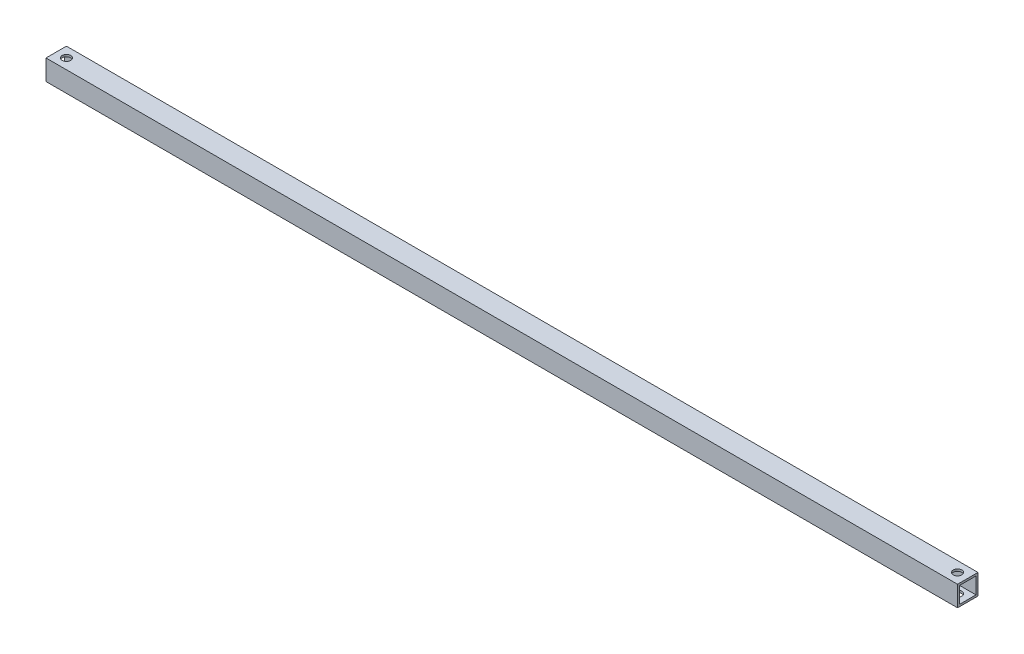
ISO-10303-21;
HEADER;
FILE_DESCRIPTION(('STEP AP214'),'2;1');
FILE_NAME('part.step','',(''),(''),'','','');
FILE_SCHEMA(('AUTOMOTIVE_DESIGN { 1 0 10303 214 1 1 1 1 }'));
ENDSEC;
DATA;
#1=APPLICATION_CONTEXT('core data for automotive mechanical design processes');
#2=APPLICATION_PROTOCOL_DEFINITION('international standard','automotive_design',2000,#1);
#3=PRODUCT_CONTEXT('',#1,'mechanical');
#4=PRODUCT('Part','Part','',(#3));
#5=PRODUCT_RELATED_PRODUCT_CATEGORY('part','',(#4));
#6=PRODUCT_DEFINITION_FORMATION('','',#4);
#7=PRODUCT_DEFINITION_CONTEXT('part definition',#1,'design');
#8=PRODUCT_DEFINITION('design','',#6,#7);
#9=PRODUCT_DEFINITION_SHAPE('','',#8);
#10=(LENGTH_UNIT() NAMED_UNIT(*) SI_UNIT(.MILLI.,.METRE.));
#11=(NAMED_UNIT(*) PLANE_ANGLE_UNIT() SI_UNIT($,.RADIAN.));
#12=(NAMED_UNIT(*) SI_UNIT($,.STERADIAN.) SOLID_ANGLE_UNIT());
#13=UNCERTAINTY_MEASURE_WITH_UNIT(LENGTH_MEASURE(1.E-05),#10,'distance_accuracy_value','');
#14=(GEOMETRIC_REPRESENTATION_CONTEXT(3) GLOBAL_UNCERTAINTY_ASSIGNED_CONTEXT((#13)) GLOBAL_UNIT_ASSIGNED_CONTEXT((#10,
#11,#12)) REPRESENTATION_CONTEXT('',''));
#15=CARTESIAN_POINT('',(0.,0.,0.));
#16=DIRECTION('',(0.,0.,1.));
#17=DIRECTION('',(1.,0.,0.));
#18=AXIS2_PLACEMENT_3D('',#15,#16,#17);
#19=CARTESIAN_POINT('',(445.586099410897,0.,0.));
#20=DIRECTION('',(1.,0.,0.));
#21=DIRECTION('',(0.,0.,-1.));
#22=AXIS2_PLACEMENT_3D('',#19,#20,#21);
#23=PLANE('',#22);
#24=DIRECTION('',(0.,0.,-1.));
#25=VECTOR('',#24,1.);
#26=CARTESIAN_POINT('',(445.586099410897,-5.,-5.));
#27=LINE('',#26,#25);
#28=CARTESIAN_POINT('',(445.586099410897,-5.,5.));
#29=VERTEX_POINT('',#28);
#30=CARTESIAN_POINT('',(445.586099410897,-5.,-5.));
#31=VERTEX_POINT('',#30);
#32=EDGE_CURVE('E183',#29,#31,#27,.T.);
#33=ORIENTED_EDGE('',*,*,#32,.T.);
#34=DIRECTION('',(0.,1.,0.));
#35=VECTOR('',#34,1.);
#36=CARTESIAN_POINT('',(445.586099410897,5.,-5.));
#37=LINE('',#36,#35);
#38=CARTESIAN_POINT('',(445.586099410897,5.,-5.));
#39=VERTEX_POINT('',#38);
#40=EDGE_CURVE('E187',#31,#39,#37,.T.);
#41=ORIENTED_EDGE('',*,*,#40,.T.);
#42=DIRECTION('',(0.,0.,1.));
#43=VECTOR('',#42,1.);
#44=CARTESIAN_POINT('',(445.586099410897,5.,-5.));
#45=LINE('',#44,#43);
#46=CARTESIAN_POINT('',(445.586099410897,5.,5.));
#47=VERTEX_POINT('',#46);
#48=EDGE_CURVE('E191',#39,#47,#45,.T.);
#49=ORIENTED_EDGE('',*,*,#48,.T.);
#50=DIRECTION('',(0.,-1.,0.));
#51=VECTOR('',#50,1.);
#52=CARTESIAN_POINT('',(445.586099410897,5.,5.));
#53=LINE('',#52,#51);
#54=EDGE_CURVE('E194',#47,#29,#53,.T.);
#55=ORIENTED_EDGE('',*,*,#54,.T.);
#56=EDGE_LOOP('',(#33,#41,#49,#55));
#57=FACE_BOUND('',#56,.T.);
#58=DIRECTION('',(0.,1.,0.));
#59=VECTOR('',#58,1.);
#60=CARTESIAN_POINT('',(445.586099410897,5.,-4.));
#61=LINE('',#60,#59);
#62=CARTESIAN_POINT('',(445.586099410897,-4.,-4.));
#63=VERTEX_POINT('',#62);
#64=CARTESIAN_POINT('',(445.586099410897,4.,-4.));
#65=VERTEX_POINT('',#64);
#66=EDGE_CURVE('E142',#63,#65,#61,.T.);
#67=ORIENTED_EDGE('',*,*,#66,.F.);
#68=DIRECTION('',(0.,0.,-1.));
#69=VECTOR('',#68,1.);
#70=CARTESIAN_POINT('',(445.586099410897,-4.,-5.));
#71=LINE('',#70,#69);
#72=CARTESIAN_POINT('',(445.586099410897,-4.,4.));
#73=VERTEX_POINT('',#72);
#74=EDGE_CURVE('E133',#73,#63,#71,.T.);
#75=ORIENTED_EDGE('',*,*,#74,.F.);
#76=DIRECTION('',(0.,-1.,0.));
#77=VECTOR('',#76,1.);
#78=CARTESIAN_POINT('',(445.586099410897,5.,4.));
#79=LINE('',#78,#77);
#80=CARTESIAN_POINT('',(445.586099410897,4.,4.));
#81=VERTEX_POINT('',#80);
#82=EDGE_CURVE('E159',#81,#73,#79,.T.);
#83=ORIENTED_EDGE('',*,*,#82,.F.);
#84=DIRECTION('',(0.,0.,1.));
#85=VECTOR('',#84,1.);
#86=CARTESIAN_POINT('',(445.586099410897,4.,-5.));
#87=LINE('',#86,#85);
#88=EDGE_CURVE('E155',#65,#81,#87,.T.);
#89=ORIENTED_EDGE('',*,*,#88,.F.);
#90=EDGE_LOOP('',(#67,#75,#83,#89));
#91=FACE_BOUND('',#90,.T.);
#92=ADVANCED_FACE('F65',(#57,#91),#23,.T.);
#93=CARTESIAN_POINT('',(0.,0.,0.));
#94=DIRECTION('',(1.,0.,0.));
#95=DIRECTION('',(0.,0.,-1.));
#96=AXIS2_PLACEMENT_3D('',#93,#94,#95);
#97=PLANE('',#96);
#98=DIRECTION('',(0.,0.,-1.));
#99=VECTOR('',#98,1.);
#100=CARTESIAN_POINT('',(0.,-5.,-5.));
#101=LINE('',#100,#99);
#102=CARTESIAN_POINT('',(0.,-5.,5.));
#103=VERTEX_POINT('',#102);
#104=CARTESIAN_POINT('',(0.,-5.,-5.));
#105=VERTEX_POINT('',#104);
#106=EDGE_CURVE('E151',#103,#105,#101,.T.);
#107=ORIENTED_EDGE('',*,*,#106,.F.);
#108=DIRECTION('',(0.,-1.,0.));
#109=VECTOR('',#108,1.);
#110=CARTESIAN_POINT('',(0.,5.,5.));
#111=LINE('',#110,#109);
#112=CARTESIAN_POINT('',(0.,5.,5.));
#113=VERTEX_POINT('',#112);
#114=EDGE_CURVE('E188',#113,#103,#111,.T.);
#115=ORIENTED_EDGE('',*,*,#114,.F.);
#116=DIRECTION('',(0.,0.,1.));
#117=VECTOR('',#116,1.);
#118=CARTESIAN_POINT('',(0.,5.,-5.));
#119=LINE('',#118,#117);
#120=CARTESIAN_POINT('',(0.,5.,-5.));
#121=VERTEX_POINT('',#120);
#122=EDGE_CURVE('E204',#121,#113,#119,.T.);
#123=ORIENTED_EDGE('',*,*,#122,.F.);
#124=DIRECTION('',(0.,1.,0.));
#125=VECTOR('',#124,1.);
#126=CARTESIAN_POINT('',(0.,5.,-5.));
#127=LINE('',#126,#125);
#128=EDGE_CURVE('E201',#105,#121,#127,.T.);
#129=ORIENTED_EDGE('',*,*,#128,.F.);
#130=EDGE_LOOP('',(#107,#115,#123,#129));
#131=FACE_BOUND('',#130,.T.);
#132=DIRECTION('',(0.,0.,-1.));
#133=VECTOR('',#132,1.);
#134=CARTESIAN_POINT('',(0.,-4.,-5.));
#135=LINE('',#134,#133);
#136=CARTESIAN_POINT('',(0.,-4.,4.));
#137=VERTEX_POINT('',#136);
#138=CARTESIAN_POINT('',(0.,-4.,-4.));
#139=VERTEX_POINT('',#138);
#140=EDGE_CURVE('E91',#137,#139,#135,.T.);
#141=ORIENTED_EDGE('',*,*,#140,.T.);
#142=DIRECTION('',(0.,1.,0.));
#143=VECTOR('',#142,1.);
#144=CARTESIAN_POINT('',(0.,5.,-4.));
#145=LINE('',#144,#143);
#146=CARTESIAN_POINT('',(0.,4.,-4.));
#147=VERTEX_POINT('',#146);
#148=EDGE_CURVE('E149',#139,#147,#145,.T.);
#149=ORIENTED_EDGE('',*,*,#148,.T.);
#150=DIRECTION('',(0.,0.,1.));
#151=VECTOR('',#150,1.);
#152=CARTESIAN_POINT('',(0.,4.,-5.));
#153=LINE('',#152,#151);
#154=CARTESIAN_POINT('',(0.,4.,4.));
#155=VERTEX_POINT('',#154);
#156=EDGE_CURVE('E170',#147,#155,#153,.T.);
#157=ORIENTED_EDGE('',*,*,#156,.T.);
#158=DIRECTION('',(0.,-1.,0.));
#159=VECTOR('',#158,1.);
#160=CARTESIAN_POINT('',(0.,5.,4.));
#161=LINE('',#160,#159);
#162=EDGE_CURVE('E143',#155,#137,#161,.T.);
#163=ORIENTED_EDGE('',*,*,#162,.T.);
#164=EDGE_LOOP('',(#141,#149,#157,#163));
#165=FACE_BOUND('',#164,.T.);
#166=ADVANCED_FACE('F264',(#131,#165),#97,.F.);
#167=CARTESIAN_POINT('',(445.586099410897,-5.,-5.));
#168=DIRECTION('',(0.,1.,0.));
#169=DIRECTION('',(0.,0.,1.));
#170=AXIS2_PLACEMENT_3D('',#167,#168,#169);
#171=PLANE('',#170);
#172=CARTESIAN_POINT('',(5.,-5.,0.));
#173=DIRECTION('',(0.,1.,0.));
#174=DIRECTION('',(0.,0.,1.));
#175=AXIS2_PLACEMENT_3D('',#172,#173,#174);
#176=CIRCLE('',#175,2.1);
#177=CARTESIAN_POINT('',(5.,-5.,2.1));
#178=VERTEX_POINT('',#177);
#179=EDGE_CURVE('E222',#178,#178,#176,.T.);
#180=ORIENTED_EDGE('',*,*,#179,.T.);
#181=EDGE_LOOP('',(#180));
#182=FACE_BOUND('',#181,.T.);
#183=CARTESIAN_POINT('',(440.586099410897,-5.,0.));
#184=DIRECTION('',(0.,1.,0.));
#185=DIRECTION('',(0.,0.,-1.));
#186=AXIS2_PLACEMENT_3D('',#183,#184,#185);
#187=CIRCLE('',#186,2.09999999999999);
#188=CARTESIAN_POINT('',(440.586099410897,-5.,2.09999999999994));
#189=VERTEX_POINT('',#188);
#190=EDGE_CURVE('E236',#189,#189,#187,.T.);
#191=ORIENTED_EDGE('',*,*,#190,.T.);
#192=EDGE_LOOP('',(#191));
#193=FACE_BOUND('',#192,.T.);
#194=ORIENTED_EDGE('',*,*,#106,.T.);
#195=DIRECTION('',(-1.,0.,0.));
#196=VECTOR('',#195,1.);
#197=CARTESIAN_POINT('',(445.586099410897,-5.,-5.));
#198=LINE('',#197,#196);
#199=EDGE_CURVE('E12',#31,#105,#198,.T.);
#200=ORIENTED_EDGE('',*,*,#199,.F.);
#201=ORIENTED_EDGE('',*,*,#32,.F.);
#202=DIRECTION('',(-1.,0.,0.));
#203=VECTOR('',#202,1.);
#204=CARTESIAN_POINT('',(445.586099410897,-5.,5.));
#205=LINE('',#204,#203);
#206=EDGE_CURVE('E197',#29,#103,#205,.T.);
#207=ORIENTED_EDGE('',*,*,#206,.T.);
#208=EDGE_LOOP('',(#194,#200,#201,#207));
#209=FACE_BOUND('',#208,.T.);
#210=ADVANCED_FACE('F67',(#182,#193,#209),#171,.F.);
#211=CARTESIAN_POINT('',(445.586099410897,5.,-5.));
#212=DIRECTION('',(0.,0.,1.));
#213=DIRECTION('',(1.,0.,0.));
#214=AXIS2_PLACEMENT_3D('',#211,#212,#213);
#215=PLANE('',#214);
#216=ORIENTED_EDGE('',*,*,#128,.T.);
#217=DIRECTION('',(-1.,0.,0.));
#218=VECTOR('',#217,1.);
#219=CARTESIAN_POINT('',(445.586099410897,5.,-5.));
#220=LINE('',#219,#218);
#221=EDGE_CURVE('E75',#39,#121,#220,.T.);
#222=ORIENTED_EDGE('',*,*,#221,.F.);
#223=ORIENTED_EDGE('',*,*,#40,.F.);
#224=ORIENTED_EDGE('',*,*,#199,.T.);
#225=EDGE_LOOP('',(#216,#222,#223,#224));
#226=FACE_BOUND('',#225,.T.);
#227=ADVANCED_FACE('F290',(#226),#215,.F.);
#228=CARTESIAN_POINT('',(445.586099410897,5.,-5.));
#229=DIRECTION('',(0.,-1.,0.));
#230=DIRECTION('',(0.,0.,-1.));
#231=AXIS2_PLACEMENT_3D('',#228,#229,#230);
#232=PLANE('',#231);
#233=CARTESIAN_POINT('',(5.,5.,0.));
#234=DIRECTION('',(0.,1.,0.));
#235=DIRECTION('',(0.,0.,1.));
#236=AXIS2_PLACEMENT_3D('',#233,#234,#235);
#237=CIRCLE('',#236,2.1);
#238=CARTESIAN_POINT('',(5.,5.,2.10000000000001));
#239=VERTEX_POINT('',#238);
#240=EDGE_CURVE('E230',#239,#239,#237,.T.);
#241=ORIENTED_EDGE('',*,*,#240,.F.);
#242=EDGE_LOOP('',(#241));
#243=FACE_BOUND('',#242,.T.);
#244=CARTESIAN_POINT('',(440.586099410897,5.,0.));
#245=DIRECTION('',(0.,1.,0.));
#246=DIRECTION('',(0.,0.,-1.));
#247=AXIS2_PLACEMENT_3D('',#244,#245,#246);
#248=CIRCLE('',#247,2.09999999999999);
#249=CARTESIAN_POINT('',(440.586099410897,5.,2.09999999999994));
#250=VERTEX_POINT('',#249);
#251=EDGE_CURVE('E242',#250,#250,#248,.T.);
#252=ORIENTED_EDGE('',*,*,#251,.F.);
#253=EDGE_LOOP('',(#252));
#254=FACE_BOUND('',#253,.T.);
#255=ORIENTED_EDGE('',*,*,#122,.T.);
#256=DIRECTION('',(-1.,0.,0.));
#257=VECTOR('',#256,1.);
#258=CARTESIAN_POINT('',(445.586099410897,5.,5.));
#259=LINE('',#258,#257);
#260=EDGE_CURVE('E212',#47,#113,#259,.T.);
#261=ORIENTED_EDGE('',*,*,#260,.F.);
#262=ORIENTED_EDGE('',*,*,#48,.F.);
#263=ORIENTED_EDGE('',*,*,#221,.T.);
#264=EDGE_LOOP('',(#255,#261,#262,#263));
#265=FACE_BOUND('',#264,.T.);
#266=ADVANCED_FACE('F287',(#243,#254,#265),#232,.F.);
#267=CARTESIAN_POINT('',(445.586099410897,5.,5.));
#268=DIRECTION('',(0.,0.,-1.));
#269=DIRECTION('',(-1.,0.,0.));
#270=AXIS2_PLACEMENT_3D('',#267,#268,#269);
#271=PLANE('',#270);
#272=ORIENTED_EDGE('',*,*,#114,.T.);
#273=ORIENTED_EDGE('',*,*,#206,.F.);
#274=ORIENTED_EDGE('',*,*,#54,.F.);
#275=ORIENTED_EDGE('',*,*,#260,.T.);
#276=EDGE_LOOP('',(#272,#273,#274,#275));
#277=FACE_BOUND('',#276,.T.);
#278=ADVANCED_FACE('F284',(#277),#271,.F.);
#279=CARTESIAN_POINT('',(445.586099410897,-4.,-5.));
#280=DIRECTION('',(0.,1.,0.));
#281=DIRECTION('',(0.,0.,1.));
#282=AXIS2_PLACEMENT_3D('',#279,#280,#281);
#283=PLANE('',#282);
#284=CARTESIAN_POINT('',(5.,-4.,0.));
#285=DIRECTION('',(0.,1.,0.));
#286=DIRECTION('',(0.,0.,1.));
#287=AXIS2_PLACEMENT_3D('',#284,#285,#286);
#288=CIRCLE('',#287,2.1);
#289=CARTESIAN_POINT('',(5.,-4.,2.1));
#290=VERTEX_POINT('',#289);
#291=EDGE_CURVE('E167',#290,#290,#288,.T.);
#292=ORIENTED_EDGE('',*,*,#291,.F.);
#293=EDGE_LOOP('',(#292));
#294=FACE_BOUND('',#293,.T.);
#295=CARTESIAN_POINT('',(440.586099410897,-4.,0.));
#296=DIRECTION('',(0.,1.,0.));
#297=DIRECTION('',(0.,0.,1.));
#298=AXIS2_PLACEMENT_3D('',#295,#296,#297);
#299=CIRCLE('',#298,2.09999999999999);
#300=CARTESIAN_POINT('',(440.586099410897,-4.,2.09999999999994));
#301=VERTEX_POINT('',#300);
#302=EDGE_CURVE('E221',#301,#301,#299,.T.);
#303=ORIENTED_EDGE('',*,*,#302,.F.);
#304=EDGE_LOOP('',(#303));
#305=FACE_BOUND('',#304,.T.);
#306=ORIENTED_EDGE('',*,*,#140,.F.);
#307=DIRECTION('',(-1.,0.,0.));
#308=VECTOR('',#307,1.);
#309=CARTESIAN_POINT('',(445.586099410897,-4.,4.));
#310=LINE('',#309,#308);
#311=EDGE_CURVE('E137',#73,#137,#310,.T.);
#312=ORIENTED_EDGE('',*,*,#311,.F.);
#313=ORIENTED_EDGE('',*,*,#74,.T.);
#314=DIRECTION('',(-1.,0.,0.));
#315=VECTOR('',#314,1.);
#316=CARTESIAN_POINT('',(445.586099410897,-4.,-4.));
#317=LINE('',#316,#315);
#318=EDGE_CURVE('E136',#63,#139,#317,.T.);
#319=ORIENTED_EDGE('',*,*,#318,.T.);
#320=EDGE_LOOP('',(#306,#312,#313,#319));
#321=FACE_BOUND('',#320,.T.);
#322=ADVANCED_FACE('F135',(#294,#305,#321),#283,.T.);
#323=CARTESIAN_POINT('',(445.586099410897,5.,-4.));
#324=DIRECTION('',(0.,0.,1.));
#325=DIRECTION('',(1.,0.,0.));
#326=AXIS2_PLACEMENT_3D('',#323,#324,#325);
#327=PLANE('',#326);
#328=ORIENTED_EDGE('',*,*,#148,.F.);
#329=ORIENTED_EDGE('',*,*,#318,.F.);
#330=ORIENTED_EDGE('',*,*,#66,.T.);
#331=DIRECTION('',(-1.,0.,0.));
#332=VECTOR('',#331,1.);
#333=CARTESIAN_POINT('',(445.586099410897,4.,-4.));
#334=LINE('',#333,#332);
#335=EDGE_CURVE('E152',#65,#147,#334,.T.);
#336=ORIENTED_EDGE('',*,*,#335,.T.);
#337=EDGE_LOOP('',(#328,#329,#330,#336));
#338=FACE_BOUND('',#337,.T.);
#339=ADVANCED_FACE('F146',(#338),#327,.T.);
#340=CARTESIAN_POINT('',(445.586099410897,4.,-5.));
#341=DIRECTION('',(0.,-1.,0.));
#342=DIRECTION('',(0.,0.,-1.));
#343=AXIS2_PLACEMENT_3D('',#340,#341,#342);
#344=PLANE('',#343);
#345=CARTESIAN_POINT('',(5.,4.,0.));
#346=DIRECTION('',(0.,-1.,0.));
#347=DIRECTION('',(0.,0.,-1.));
#348=AXIS2_PLACEMENT_3D('',#345,#346,#347);
#349=CIRCLE('',#348,2.1);
#350=CARTESIAN_POINT('',(5.,4.,2.10000000000001));
#351=VERTEX_POINT('',#350);
#352=EDGE_CURVE('E69',#351,#351,#349,.T.);
#353=ORIENTED_EDGE('',*,*,#352,.F.);
#354=EDGE_LOOP('',(#353));
#355=FACE_BOUND('',#354,.T.);
#356=CARTESIAN_POINT('',(440.586099410897,4.,0.));
#357=DIRECTION('',(0.,-1.,0.));
#358=DIRECTION('',(0.,0.,-1.));
#359=AXIS2_PLACEMENT_3D('',#356,#357,#358);
#360=CIRCLE('',#359,2.09999999999999);
#361=CARTESIAN_POINT('',(440.586099410897,4.,2.09999999999994));
#362=VERTEX_POINT('',#361);
#363=EDGE_CURVE('E218',#362,#362,#360,.T.);
#364=ORIENTED_EDGE('',*,*,#363,.F.);
#365=EDGE_LOOP('',(#364));
#366=FACE_BOUND('',#365,.T.);
#367=ORIENTED_EDGE('',*,*,#156,.F.);
#368=ORIENTED_EDGE('',*,*,#335,.F.);
#369=ORIENTED_EDGE('',*,*,#88,.T.);
#370=DIRECTION('',(-1.,0.,0.));
#371=VECTOR('',#370,1.);
#372=CARTESIAN_POINT('',(445.586099410897,4.,4.));
#373=LINE('',#372,#371);
#374=EDGE_CURVE('E83',#81,#155,#373,.T.);
#375=ORIENTED_EDGE('',*,*,#374,.T.);
#376=EDGE_LOOP('',(#367,#368,#369,#375));
#377=FACE_BOUND('',#376,.T.);
#378=ADVANCED_FACE('F256',(#355,#366,#377),#344,.T.);
#379=CARTESIAN_POINT('',(445.586099410897,5.,4.));
#380=DIRECTION('',(0.,0.,-1.));
#381=DIRECTION('',(-1.,0.,0.));
#382=AXIS2_PLACEMENT_3D('',#379,#380,#381);
#383=PLANE('',#382);
#384=ORIENTED_EDGE('',*,*,#162,.F.);
#385=ORIENTED_EDGE('',*,*,#374,.F.);
#386=ORIENTED_EDGE('',*,*,#82,.T.);
#387=ORIENTED_EDGE('',*,*,#311,.T.);
#388=EDGE_LOOP('',(#384,#385,#386,#387));
#389=FACE_BOUND('',#388,.T.);
#390=ADVANCED_FACE('F259',(#389),#383,.T.);
#391=CARTESIAN_POINT('',(440.586099410897,-5.,0.));
#392=DIRECTION('',(0.,1.,0.));
#393=DIRECTION('',(0.,0.,1.));
#394=AXIS2_PLACEMENT_3D('',#391,#392,#393);
#395=CYLINDRICAL_SURFACE('',#394,2.09999999999999);
#396=CARTESIAN_POINT('',(440.586099410897,4.,2.09999999999994));
#397=CARTESIAN_POINT('',(440.586099410897,4.01041666666667,2.09999999999994));
#398=CARTESIAN_POINT('',(440.586099410897,4.02083333333333,2.09999999999994));
#399=CARTESIAN_POINT('',(440.586099410897,4.04166666666667,2.09999999999994));
#400=CARTESIAN_POINT('',(440.586099410897,4.05208333333333,2.09999999999994));
#401=CARTESIAN_POINT('',(440.586099410897,4.07291666666667,2.09999999999994));
#402=CARTESIAN_POINT('',(440.586099410897,4.08333333333333,2.09999999999994));
#403=CARTESIAN_POINT('',(440.586099410897,4.10416666666667,2.09999999999994));
#404=CARTESIAN_POINT('',(440.586099410897,4.11458333333333,2.09999999999994));
#405=CARTESIAN_POINT('',(440.586099410897,4.13541666666667,2.09999999999994));
#406=CARTESIAN_POINT('',(440.586099410897,4.14583333333333,2.09999999999994));
#407=CARTESIAN_POINT('',(440.586099410897,4.16666666666667,2.09999999999994));
#408=CARTESIAN_POINT('',(440.586099410897,4.17708333333333,2.09999999999994));
#409=CARTESIAN_POINT('',(440.586099410897,4.19791666666667,2.09999999999994));
#410=CARTESIAN_POINT('',(440.586099410897,4.20833333333333,2.09999999999994));
#411=CARTESIAN_POINT('',(440.586099410897,4.22916666666667,2.09999999999994));
#412=CARTESIAN_POINT('',(440.586099410897,4.23958333333333,2.09999999999994));
#413=CARTESIAN_POINT('',(440.586099410897,4.26041666666667,2.09999999999994));
#414=CARTESIAN_POINT('',(440.586099410897,4.27083333333333,2.09999999999994));
#415=CARTESIAN_POINT('',(440.586099410897,4.29166666666667,2.09999999999994));
#416=CARTESIAN_POINT('',(440.586099410897,4.30208333333333,2.09999999999994));
#417=CARTESIAN_POINT('',(440.586099410897,4.32291666666667,2.09999999999994));
#418=CARTESIAN_POINT('',(440.586099410897,4.33333333333333,2.09999999999994));
#419=CARTESIAN_POINT('',(440.586099410897,4.35416666666667,2.09999999999994));
#420=CARTESIAN_POINT('',(440.586099410897,4.36458333333333,2.09999999999994));
#421=CARTESIAN_POINT('',(440.586099410897,4.38541666666667,2.09999999999994));
#422=CARTESIAN_POINT('',(440.586099410897,4.39583333333333,2.09999999999994));
#423=CARTESIAN_POINT('',(440.586099410897,4.41666666666667,2.09999999999994));
#424=CARTESIAN_POINT('',(440.586099410897,4.42708333333333,2.09999999999994));
#425=CARTESIAN_POINT('',(440.586099410897,4.44791666666667,2.09999999999994));
#426=CARTESIAN_POINT('',(440.586099410897,4.45833333333333,2.09999999999994));
#427=CARTESIAN_POINT('',(440.586099410897,4.47916666666667,2.09999999999994));
#428=CARTESIAN_POINT('',(440.586099410897,4.48958333333333,2.09999999999994));
#429=CARTESIAN_POINT('',(440.586099410897,4.51041666666667,2.09999999999994));
#430=CARTESIAN_POINT('',(440.586099410897,4.52083333333333,2.09999999999994));
#431=CARTESIAN_POINT('',(440.586099410897,4.54166666666667,2.09999999999994));
#432=CARTESIAN_POINT('',(440.586099410897,4.55208333333333,2.09999999999994));
#433=CARTESIAN_POINT('',(440.586099410897,4.57291666666667,2.09999999999994));
#434=CARTESIAN_POINT('',(440.586099410897,4.58333333333333,2.09999999999994));
#435=CARTESIAN_POINT('',(440.586099410897,4.60416666666667,2.09999999999994));
#436=CARTESIAN_POINT('',(440.586099410897,4.61458333333333,2.09999999999994));
#437=CARTESIAN_POINT('',(440.586099410897,4.63541666666667,2.09999999999994));
#438=CARTESIAN_POINT('',(440.586099410897,4.64583333333333,2.09999999999994));
#439=CARTESIAN_POINT('',(440.586099410897,4.66666666666667,2.09999999999994));
#440=CARTESIAN_POINT('',(440.586099410897,4.67708333333333,2.09999999999994));
#441=CARTESIAN_POINT('',(440.586099410897,4.69791666666667,2.09999999999994));
#442=CARTESIAN_POINT('',(440.586099410897,4.70833333333333,2.09999999999994));
#443=CARTESIAN_POINT('',(440.586099410897,4.72916666666667,2.09999999999994));
#444=CARTESIAN_POINT('',(440.586099410897,4.73958333333333,2.09999999999994));
#445=CARTESIAN_POINT('',(440.586099410897,4.76041666666667,2.09999999999994));
#446=CARTESIAN_POINT('',(440.586099410897,4.77083333333333,2.09999999999994));
#447=CARTESIAN_POINT('',(440.586099410897,4.79166666666667,2.09999999999994));
#448=CARTESIAN_POINT('',(440.586099410897,4.80208333333333,2.09999999999994));
#449=CARTESIAN_POINT('',(440.586099410897,4.82291666666667,2.09999999999994));
#450=CARTESIAN_POINT('',(440.586099410897,4.83333333333333,2.09999999999994));
#451=CARTESIAN_POINT('',(440.586099410897,4.85416666666667,2.09999999999994));
#452=CARTESIAN_POINT('',(440.586099410897,4.86458333333333,2.09999999999994));
#453=CARTESIAN_POINT('',(440.586099410897,4.88541666666667,2.09999999999994));
#454=CARTESIAN_POINT('',(440.586099410897,4.89583333333333,2.09999999999994));
#455=CARTESIAN_POINT('',(440.586099410897,4.91666666666667,2.09999999999994));
#456=CARTESIAN_POINT('',(440.586099410897,4.92708333333333,2.09999999999994));
#457=CARTESIAN_POINT('',(440.586099410897,4.94791666666667,2.09999999999994));
#458=CARTESIAN_POINT('',(440.586099410897,4.95833333333333,2.09999999999994));
#459=CARTESIAN_POINT('',(440.586099410897,4.97916666666667,2.09999999999994));
#460=CARTESIAN_POINT('',(440.586099410897,4.98958333333333,2.09999999999994));
#461=CARTESIAN_POINT('',(440.586099410897,5.,2.09999999999994));
#462=B_SPLINE_CURVE_WITH_KNOTS('',3,(#396,#397,#398,#399,#400,#401,#402,#403,#404,#405,#406,
#407,#408,#409,#410,#411,#412,#413,#414,#415,#416,#417,#418,#419,#420,#421,#422,#423,#424,#425,
#426,#427,#428,#429,#430,#431,#432,#433,#434,#435,#436,#437,#438,#439,#440,#441,#442,#443,#444,
#445,#446,#447,#448,#449,#450,#451,#452,#453,#454,#455,#456,#457,#458,#459,#460,#461),
.UNSPECIFIED.,.F.,.F.,(4,2,2,2,2,2,2,2,2,2,2,2,2,2,2,2,2,2,2,2,2,2,2,2,2,2,2,2,2,2,2,2,4),(0.,
0.03125,0.0625000000000001,0.0937500000000001,0.125,0.15625,0.1875,0.21875,0.25,0.28125,0.3125,
0.34375,0.375,0.40625,0.4375,0.46875,0.5,0.53125,0.5625,0.593750000000001,0.625000000000001,
0.656250000000001,0.687500000000001,0.718750000000001,0.750000000000001,0.781250000000001,
0.812500000000001,0.843750000000001,0.875000000000001,0.906250000000001,0.937500000000001,
0.968750000000001,1.),.UNSPECIFIED.);
#463=EDGE_CURVE('BSEAM266',#362,#250,#462,.T.);
#464=ORIENTED_EDGE('',*,*,#363,.T.);
#465=ORIENTED_EDGE('',*,*,#251,.T.);
#466=ORIENTED_EDGE('',*,*,#463,.T.);
#467=ORIENTED_EDGE('',*,*,#463,.F.);
#468=EDGE_LOOP('',(#464,#466,#465,#467));
#469=FACE_BOUND('',#468,.T.);
#470=ADVANCED_FACE('F266',(#469),#395,.F.);
#471=CARTESIAN_POINT('',(5.,-5.,0.));
#472=DIRECTION('',(0.,1.,0.));
#473=DIRECTION('',(0.,0.,1.));
#474=AXIS2_PLACEMENT_3D('',#471,#472,#473);
#475=CYLINDRICAL_SURFACE('',#474,2.1);
#476=CARTESIAN_POINT('',(5.,4.,2.10000000000001));
#477=CARTESIAN_POINT('',(5.,4.01041666666667,2.10000000000001));
#478=CARTESIAN_POINT('',(5.,4.02083333333333,2.10000000000001));
#479=CARTESIAN_POINT('',(5.,4.04166666666667,2.10000000000001));
#480=CARTESIAN_POINT('',(5.,4.05208333333333,2.10000000000001));
#481=CARTESIAN_POINT('',(5.,4.07291666666667,2.10000000000001));
#482=CARTESIAN_POINT('',(5.,4.08333333333333,2.10000000000001));
#483=CARTESIAN_POINT('',(5.,4.10416666666667,2.10000000000001));
#484=CARTESIAN_POINT('',(5.,4.11458333333333,2.10000000000001));
#485=CARTESIAN_POINT('',(5.,4.13541666666667,2.10000000000001));
#486=CARTESIAN_POINT('',(5.,4.14583333333333,2.10000000000001));
#487=CARTESIAN_POINT('',(5.,4.16666666666667,2.10000000000001));
#488=CARTESIAN_POINT('',(5.,4.17708333333333,2.10000000000001));
#489=CARTESIAN_POINT('',(5.,4.19791666666667,2.10000000000001));
#490=CARTESIAN_POINT('',(5.,4.20833333333333,2.10000000000001));
#491=CARTESIAN_POINT('',(5.,4.22916666666667,2.10000000000001));
#492=CARTESIAN_POINT('',(5.,4.23958333333333,2.10000000000001));
#493=CARTESIAN_POINT('',(5.,4.26041666666667,2.10000000000001));
#494=CARTESIAN_POINT('',(5.,4.27083333333333,2.10000000000001));
#495=CARTESIAN_POINT('',(5.,4.29166666666667,2.10000000000001));
#496=CARTESIAN_POINT('',(5.,4.30208333333333,2.10000000000001));
#497=CARTESIAN_POINT('',(5.,4.32291666666667,2.10000000000001));
#498=CARTESIAN_POINT('',(5.,4.33333333333333,2.10000000000001));
#499=CARTESIAN_POINT('',(5.,4.35416666666667,2.10000000000001));
#500=CARTESIAN_POINT('',(5.,4.36458333333333,2.10000000000001));
#501=CARTESIAN_POINT('',(5.,4.38541666666667,2.10000000000001));
#502=CARTESIAN_POINT('',(5.,4.39583333333333,2.10000000000001));
#503=CARTESIAN_POINT('',(5.,4.41666666666667,2.10000000000001));
#504=CARTESIAN_POINT('',(5.,4.42708333333333,2.10000000000001));
#505=CARTESIAN_POINT('',(5.,4.44791666666667,2.10000000000001));
#506=CARTESIAN_POINT('',(5.,4.45833333333333,2.10000000000001));
#507=CARTESIAN_POINT('',(5.,4.47916666666667,2.10000000000001));
#508=CARTESIAN_POINT('',(5.,4.48958333333333,2.10000000000001));
#509=CARTESIAN_POINT('',(5.,4.51041666666667,2.10000000000001));
#510=CARTESIAN_POINT('',(5.,4.52083333333333,2.10000000000001));
#511=CARTESIAN_POINT('',(5.,4.54166666666667,2.10000000000001));
#512=CARTESIAN_POINT('',(5.,4.55208333333333,2.10000000000001));
#513=CARTESIAN_POINT('',(5.,4.57291666666667,2.10000000000001));
#514=CARTESIAN_POINT('',(5.,4.58333333333333,2.10000000000001));
#515=CARTESIAN_POINT('',(5.,4.60416666666667,2.10000000000001));
#516=CARTESIAN_POINT('',(5.,4.61458333333333,2.10000000000001));
#517=CARTESIAN_POINT('',(5.,4.63541666666667,2.10000000000001));
#518=CARTESIAN_POINT('',(5.,4.64583333333333,2.10000000000001));
#519=CARTESIAN_POINT('',(5.,4.66666666666667,2.10000000000001));
#520=CARTESIAN_POINT('',(5.,4.67708333333333,2.10000000000001));
#521=CARTESIAN_POINT('',(5.,4.69791666666667,2.10000000000001));
#522=CARTESIAN_POINT('',(5.,4.70833333333333,2.10000000000001));
#523=CARTESIAN_POINT('',(5.,4.72916666666667,2.10000000000001));
#524=CARTESIAN_POINT('',(5.,4.73958333333333,2.10000000000001));
#525=CARTESIAN_POINT('',(5.,4.76041666666667,2.10000000000001));
#526=CARTESIAN_POINT('',(5.,4.77083333333333,2.10000000000001));
#527=CARTESIAN_POINT('',(5.,4.79166666666667,2.10000000000001));
#528=CARTESIAN_POINT('',(5.,4.80208333333333,2.10000000000001));
#529=CARTESIAN_POINT('',(5.,4.82291666666667,2.10000000000001));
#530=CARTESIAN_POINT('',(5.,4.83333333333333,2.10000000000001));
#531=CARTESIAN_POINT('',(5.,4.85416666666667,2.10000000000001));
#532=CARTESIAN_POINT('',(5.,4.86458333333333,2.10000000000001));
#533=CARTESIAN_POINT('',(5.,4.88541666666667,2.10000000000001));
#534=CARTESIAN_POINT('',(5.,4.89583333333333,2.10000000000001));
#535=CARTESIAN_POINT('',(5.,4.91666666666667,2.10000000000001));
#536=CARTESIAN_POINT('',(5.,4.92708333333333,2.10000000000001));
#537=CARTESIAN_POINT('',(5.,4.94791666666667,2.10000000000001));
#538=CARTESIAN_POINT('',(5.,4.95833333333333,2.10000000000001));
#539=CARTESIAN_POINT('',(5.,4.97916666666667,2.10000000000001));
#540=CARTESIAN_POINT('',(5.,4.98958333333333,2.10000000000001));
#541=CARTESIAN_POINT('',(5.,5.,2.10000000000001));
#542=B_SPLINE_CURVE_WITH_KNOTS('',3,(#476,#477,#478,#479,#480,#481,#482,#483,#484,#485,#486,
#487,#488,#489,#490,#491,#492,#493,#494,#495,#496,#497,#498,#499,#500,#501,#502,#503,#504,#505,
#506,#507,#508,#509,#510,#511,#512,#513,#514,#515,#516,#517,#518,#519,#520,#521,#522,#523,#524,
#525,#526,#527,#528,#529,#530,#531,#532,#533,#534,#535,#536,#537,#538,#539,#540,#541),
.UNSPECIFIED.,.F.,.F.,(4,2,2,2,2,2,2,2,2,2,2,2,2,2,2,2,2,2,2,2,2,2,2,2,2,2,2,2,2,2,2,2,4),(0.,
0.03125,0.0625000000000001,0.0937500000000001,0.125,0.15625,0.1875,0.21875,0.25,0.28125,0.3125,
0.34375,0.375,0.40625,0.4375,0.46875,0.5,0.53125,0.5625,0.593750000000001,0.625000000000001,
0.656250000000001,0.687500000000001,0.718750000000001,0.750000000000001,0.781250000000001,
0.812500000000001,0.843750000000001,0.875000000000001,0.906250000000001,0.937500000000001,
0.968750000000001,1.),.UNSPECIFIED.);
#543=EDGE_CURVE('BSEAM253',#351,#239,#542,.T.);
#544=ORIENTED_EDGE('',*,*,#352,.T.);
#545=ORIENTED_EDGE('',*,*,#240,.T.);
#546=ORIENTED_EDGE('',*,*,#543,.T.);
#547=ORIENTED_EDGE('',*,*,#543,.F.);
#548=EDGE_LOOP('',(#544,#546,#545,#547));
#549=FACE_BOUND('',#548,.T.);
#550=ADVANCED_FACE('F253',(#549),#475,.F.);
#551=CARTESIAN_POINT('',(440.586099410897,-4.,2.09999999999994));
#552=CARTESIAN_POINT('',(440.586099410897,-4.01041666666667,2.09999999999994));
#553=CARTESIAN_POINT('',(440.586099410897,-4.02083333333333,2.09999999999994));
#554=CARTESIAN_POINT('',(440.586099410897,-4.04166666666667,2.09999999999994));
#555=CARTESIAN_POINT('',(440.586099410897,-4.05208333333333,2.09999999999994));
#556=CARTESIAN_POINT('',(440.586099410897,-4.07291666666667,2.09999999999994));
#557=CARTESIAN_POINT('',(440.586099410897,-4.08333333333333,2.09999999999994));
#558=CARTESIAN_POINT('',(440.586099410897,-4.10416666666667,2.09999999999994));
#559=CARTESIAN_POINT('',(440.586099410897,-4.11458333333333,2.09999999999994));
#560=CARTESIAN_POINT('',(440.586099410897,-4.13541666666667,2.09999999999994));
#561=CARTESIAN_POINT('',(440.586099410897,-4.14583333333333,2.09999999999994));
#562=CARTESIAN_POINT('',(440.586099410897,-4.16666666666667,2.09999999999994));
#563=CARTESIAN_POINT('',(440.586099410897,-4.17708333333333,2.09999999999994));
#564=CARTESIAN_POINT('',(440.586099410897,-4.19791666666667,2.09999999999994));
#565=CARTESIAN_POINT('',(440.586099410897,-4.20833333333333,2.09999999999994));
#566=CARTESIAN_POINT('',(440.586099410897,-4.22916666666667,2.09999999999994));
#567=CARTESIAN_POINT('',(440.586099410897,-4.23958333333333,2.09999999999994));
#568=CARTESIAN_POINT('',(440.586099410897,-4.26041666666667,2.09999999999994));
#569=CARTESIAN_POINT('',(440.586099410897,-4.27083333333333,2.09999999999994));
#570=CARTESIAN_POINT('',(440.586099410897,-4.29166666666667,2.09999999999994));
#571=CARTESIAN_POINT('',(440.586099410897,-4.30208333333334,2.09999999999994));
#572=CARTESIAN_POINT('',(440.586099410897,-4.32291666666667,2.09999999999994));
#573=CARTESIAN_POINT('',(440.586099410897,-4.33333333333334,2.09999999999994));
#574=CARTESIAN_POINT('',(440.586099410897,-4.35416666666667,2.09999999999994));
#575=CARTESIAN_POINT('',(440.586099410897,-4.36458333333334,2.09999999999994));
#576=CARTESIAN_POINT('',(440.586099410897,-4.38541666666667,2.09999999999994));
#577=CARTESIAN_POINT('',(440.586099410897,-4.39583333333334,2.09999999999994));
#578=CARTESIAN_POINT('',(440.586099410897,-4.41666666666667,2.09999999999994));
#579=CARTESIAN_POINT('',(440.586099410897,-4.42708333333334,2.09999999999994));
#580=CARTESIAN_POINT('',(440.586099410897,-4.44791666666667,2.09999999999994));
#581=CARTESIAN_POINT('',(440.586099410897,-4.45833333333334,2.09999999999994));
#582=CARTESIAN_POINT('',(440.586099410897,-4.47916666666667,2.09999999999994));
#583=CARTESIAN_POINT('',(440.586099410897,-4.48958333333334,2.09999999999994));
#584=CARTESIAN_POINT('',(440.586099410897,-4.51041666666667,2.09999999999994));
#585=CARTESIAN_POINT('',(440.586099410897,-4.52083333333334,2.09999999999994));
#586=CARTESIAN_POINT('',(440.586099410897,-4.54166666666667,2.09999999999994));
#587=CARTESIAN_POINT('',(440.586099410897,-4.55208333333334,2.09999999999994));
#588=CARTESIAN_POINT('',(440.586099410897,-4.57291666666667,2.09999999999994));
#589=CARTESIAN_POINT('',(440.586099410897,-4.58333333333334,2.09999999999994));
#590=CARTESIAN_POINT('',(440.586099410897,-4.60416666666667,2.09999999999994));
#591=CARTESIAN_POINT('',(440.586099410897,-4.61458333333334,2.09999999999994));
#592=CARTESIAN_POINT('',(440.586099410897,-4.63541666666667,2.09999999999994));
#593=CARTESIAN_POINT('',(440.586099410897,-4.64583333333334,2.09999999999994));
#594=CARTESIAN_POINT('',(440.586099410897,-4.66666666666667,2.09999999999994));
#595=CARTESIAN_POINT('',(440.586099410897,-4.67708333333334,2.09999999999994));
#596=CARTESIAN_POINT('',(440.586099410897,-4.69791666666667,2.09999999999994));
#597=CARTESIAN_POINT('',(440.586099410897,-4.70833333333334,2.09999999999994));
#598=CARTESIAN_POINT('',(440.586099410897,-4.72916666666667,2.09999999999994));
#599=CARTESIAN_POINT('',(440.586099410897,-4.73958333333334,2.09999999999994));
#600=CARTESIAN_POINT('',(440.586099410897,-4.76041666666667,2.09999999999994));
#601=CARTESIAN_POINT('',(440.586099410897,-4.77083333333334,2.09999999999994));
#602=CARTESIAN_POINT('',(440.586099410897,-4.79166666666667,2.09999999999994));
#603=CARTESIAN_POINT('',(440.586099410897,-4.80208333333334,2.09999999999994));
#604=CARTESIAN_POINT('',(440.586099410897,-4.82291666666667,2.09999999999994));
#605=CARTESIAN_POINT('',(440.586099410897,-4.83333333333334,2.09999999999994));
#606=CARTESIAN_POINT('',(440.586099410897,-4.85416666666667,2.09999999999994));
#607=CARTESIAN_POINT('',(440.586099410897,-4.86458333333334,2.09999999999994));
#608=CARTESIAN_POINT('',(440.586099410897,-4.88541666666667,2.09999999999994));
#609=CARTESIAN_POINT('',(440.586099410897,-4.89583333333334,2.09999999999994));
#610=CARTESIAN_POINT('',(440.586099410897,-4.91666666666667,2.09999999999994));
#611=CARTESIAN_POINT('',(440.586099410897,-4.92708333333334,2.09999999999994));
#612=CARTESIAN_POINT('',(440.586099410897,-4.94791666666667,2.09999999999994));
#613=CARTESIAN_POINT('',(440.586099410897,-4.95833333333334,2.09999999999994));
#614=CARTESIAN_POINT('',(440.586099410897,-4.97916666666667,2.09999999999994));
#615=CARTESIAN_POINT('',(440.586099410897,-4.98958333333334,2.09999999999994));
#616=CARTESIAN_POINT('',(440.586099410897,-5.,2.09999999999994));
#617=B_SPLINE_CURVE_WITH_KNOTS('',3,(#551,#552,#553,#554,#555,#556,#557,#558,#559,#560,#561,
#562,#563,#564,#565,#566,#567,#568,#569,#570,#571,#572,#573,#574,#575,#576,#577,#578,#579,#580,
#581,#582,#583,#584,#585,#586,#587,#588,#589,#590,#591,#592,#593,#594,#595,#596,#597,#598,#599,
#600,#601,#602,#603,#604,#605,#606,#607,#608,#609,#610,#611,#612,#613,#614,#615,#616),
.UNSPECIFIED.,.F.,.F.,(4,2,2,2,2,2,2,2,2,2,2,2,2,2,2,2,2,2,2,2,2,2,2,2,2,2,2,2,2,2,2,2,4),(0.,
0.03125,0.0625000000000001,0.0937500000000001,0.125,0.15625,0.1875,0.21875,0.25,
0.281250000000001,0.312500000000001,0.343750000000001,0.375000000000001,0.406250000000001,
0.437500000000001,0.468750000000001,0.500000000000001,0.531250000000001,0.562500000000001,
0.593750000000001,0.625000000000001,0.656250000000002,0.687500000000002,0.718750000000002,
0.750000000000002,0.781250000000002,0.812500000000002,0.843750000000002,0.875000000000003,
0.906250000000003,0.937500000000003,0.968750000000003,1.),.UNSPECIFIED.);
#618=EDGE_CURVE('BSEAM272',#301,#189,#617,.T.);
#619=ORIENTED_EDGE('',*,*,#302,.T.);
#620=ORIENTED_EDGE('',*,*,#190,.F.);
#621=ORIENTED_EDGE('',*,*,#618,.T.);
#622=ORIENTED_EDGE('',*,*,#618,.F.);
#623=EDGE_LOOP('',(#619,#621,#620,#622));
#624=FACE_BOUND('',#623,.T.);
#625=ADVANCED_FACE('F272',(#624),#395,.F.);
#626=CARTESIAN_POINT('',(5.,-4.,2.1));
#627=CARTESIAN_POINT('',(5.,-4.01041666666667,2.1));
#628=CARTESIAN_POINT('',(5.,-4.02083333333333,2.1));
#629=CARTESIAN_POINT('',(5.,-4.04166666666667,2.1));
#630=CARTESIAN_POINT('',(5.,-4.05208333333333,2.1));
#631=CARTESIAN_POINT('',(5.,-4.07291666666667,2.1));
#632=CARTESIAN_POINT('',(5.,-4.08333333333333,2.1));
#633=CARTESIAN_POINT('',(5.,-4.10416666666667,2.1));
#634=CARTESIAN_POINT('',(5.,-4.11458333333333,2.1));
#635=CARTESIAN_POINT('',(5.,-4.13541666666667,2.1));
#636=CARTESIAN_POINT('',(5.,-4.14583333333333,2.1));
#637=CARTESIAN_POINT('',(5.,-4.16666666666667,2.1));
#638=CARTESIAN_POINT('',(5.,-4.17708333333333,2.1));
#639=CARTESIAN_POINT('',(5.,-4.19791666666667,2.1));
#640=CARTESIAN_POINT('',(5.,-4.20833333333333,2.1));
#641=CARTESIAN_POINT('',(5.,-4.22916666666667,2.1));
#642=CARTESIAN_POINT('',(5.,-4.23958333333333,2.1));
#643=CARTESIAN_POINT('',(5.,-4.26041666666667,2.1));
#644=CARTESIAN_POINT('',(5.,-4.27083333333333,2.1));
#645=CARTESIAN_POINT('',(5.,-4.29166666666667,2.1));
#646=CARTESIAN_POINT('',(5.,-4.30208333333334,2.1));
#647=CARTESIAN_POINT('',(5.,-4.32291666666667,2.1));
#648=CARTESIAN_POINT('',(5.,-4.33333333333334,2.1));
#649=CARTESIAN_POINT('',(5.,-4.35416666666667,2.1));
#650=CARTESIAN_POINT('',(5.,-4.36458333333334,2.1));
#651=CARTESIAN_POINT('',(5.,-4.38541666666667,2.1));
#652=CARTESIAN_POINT('',(5.,-4.39583333333334,2.1));
#653=CARTESIAN_POINT('',(5.,-4.41666666666667,2.1));
#654=CARTESIAN_POINT('',(5.,-4.42708333333334,2.1));
#655=CARTESIAN_POINT('',(5.,-4.44791666666667,2.1));
#656=CARTESIAN_POINT('',(5.,-4.45833333333334,2.1));
#657=CARTESIAN_POINT('',(5.,-4.47916666666667,2.1));
#658=CARTESIAN_POINT('',(5.,-4.48958333333334,2.1));
#659=CARTESIAN_POINT('',(5.,-4.51041666666667,2.1));
#660=CARTESIAN_POINT('',(5.,-4.52083333333334,2.1));
#661=CARTESIAN_POINT('',(5.,-4.54166666666667,2.1));
#662=CARTESIAN_POINT('',(5.,-4.55208333333334,2.1));
#663=CARTESIAN_POINT('',(5.,-4.57291666666667,2.1));
#664=CARTESIAN_POINT('',(5.,-4.58333333333334,2.1));
#665=CARTESIAN_POINT('',(5.,-4.60416666666667,2.1));
#666=CARTESIAN_POINT('',(5.,-4.61458333333334,2.1));
#667=CARTESIAN_POINT('',(5.,-4.63541666666667,2.1));
#668=CARTESIAN_POINT('',(5.,-4.64583333333334,2.1));
#669=CARTESIAN_POINT('',(5.,-4.66666666666667,2.1));
#670=CARTESIAN_POINT('',(5.,-4.67708333333334,2.1));
#671=CARTESIAN_POINT('',(5.,-4.69791666666667,2.1));
#672=CARTESIAN_POINT('',(5.,-4.70833333333334,2.1));
#673=CARTESIAN_POINT('',(5.,-4.72916666666667,2.1));
#674=CARTESIAN_POINT('',(5.,-4.73958333333334,2.1));
#675=CARTESIAN_POINT('',(5.,-4.76041666666667,2.1));
#676=CARTESIAN_POINT('',(5.,-4.77083333333334,2.1));
#677=CARTESIAN_POINT('',(5.,-4.79166666666667,2.1));
#678=CARTESIAN_POINT('',(5.,-4.80208333333334,2.1));
#679=CARTESIAN_POINT('',(5.,-4.82291666666667,2.1));
#680=CARTESIAN_POINT('',(5.,-4.83333333333334,2.1));
#681=CARTESIAN_POINT('',(5.,-4.85416666666667,2.1));
#682=CARTESIAN_POINT('',(5.,-4.86458333333334,2.1));
#683=CARTESIAN_POINT('',(5.,-4.88541666666667,2.1));
#684=CARTESIAN_POINT('',(5.,-4.89583333333334,2.1));
#685=CARTESIAN_POINT('',(5.,-4.91666666666667,2.1));
#686=CARTESIAN_POINT('',(5.,-4.92708333333334,2.1));
#687=CARTESIAN_POINT('',(5.,-4.94791666666667,2.1));
#688=CARTESIAN_POINT('',(5.,-4.95833333333334,2.1));
#689=CARTESIAN_POINT('',(5.,-4.97916666666667,2.1));
#690=CARTESIAN_POINT('',(5.,-4.98958333333334,2.1));
#691=CARTESIAN_POINT('',(5.,-5.,2.1));
#692=B_SPLINE_CURVE_WITH_KNOTS('',3,(#626,#627,#628,#629,#630,#631,#632,#633,#634,#635,#636,
#637,#638,#639,#640,#641,#642,#643,#644,#645,#646,#647,#648,#649,#650,#651,#652,#653,#654,#655,
#656,#657,#658,#659,#660,#661,#662,#663,#664,#665,#666,#667,#668,#669,#670,#671,#672,#673,#674,
#675,#676,#677,#678,#679,#680,#681,#682,#683,#684,#685,#686,#687,#688,#689,#690,#691),
.UNSPECIFIED.,.F.,.F.,(4,2,2,2,2,2,2,2,2,2,2,2,2,2,2,2,2,2,2,2,2,2,2,2,2,2,2,2,2,2,2,2,4),(0.,
0.03125,0.0625000000000001,0.0937500000000001,0.125,0.15625,0.1875,0.21875,0.25,
0.281250000000001,0.312500000000001,0.343750000000001,0.375000000000001,0.406250000000001,
0.437500000000001,0.468750000000001,0.500000000000001,0.531250000000001,0.562500000000001,
0.593750000000001,0.625000000000001,0.656250000000002,0.687500000000002,0.718750000000002,
0.750000000000002,0.781250000000002,0.812500000000002,0.843750000000002,0.875000000000003,
0.906250000000003,0.937500000000003,0.968750000000003,1.),.UNSPECIFIED.);
#693=EDGE_CURVE('BSEAM315',#290,#178,#692,.T.);
#694=ORIENTED_EDGE('',*,*,#291,.T.);
#695=ORIENTED_EDGE('',*,*,#179,.F.);
#696=ORIENTED_EDGE('',*,*,#693,.T.);
#697=ORIENTED_EDGE('',*,*,#693,.F.);
#698=EDGE_LOOP('',(#694,#696,#695,#697));
#699=FACE_BOUND('',#698,.T.);
#700=ADVANCED_FACE('F315',(#699),#475,.F.);
#701=CLOSED_SHELL('',(#92,#166,#210,#227,#266,#278,#322,#339,#378,#390,#470,#550,#625,#700));
#702=MANIFOLD_SOLID_BREP('B2',#701);
#703=ADVANCED_BREP_SHAPE_REPRESENTATION('',(#18,#702),#14);
#704=SHAPE_DEFINITION_REPRESENTATION(#9,#703);
ENDSEC;
END-ISO-10303-21;
